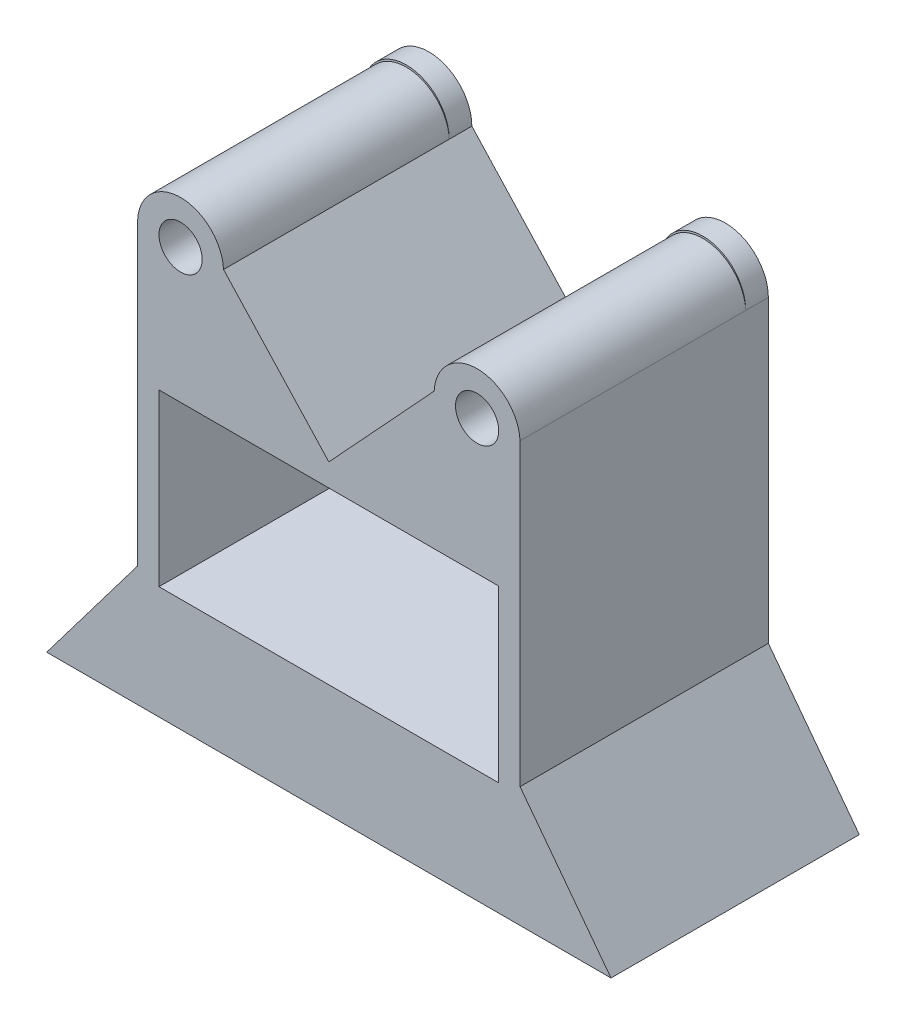
ISO-10303-21;
HEADER;
FILE_DESCRIPTION(('STEP AP214'),'2;1');
FILE_NAME('part.step','',(''),(''),'','','');
FILE_SCHEMA(('AUTOMOTIVE_DESIGN { 1 0 10303 214 1 1 1 1 }'));
ENDSEC;
DATA;
#1=APPLICATION_CONTEXT('core data for automotive mechanical design processes');
#2=APPLICATION_PROTOCOL_DEFINITION('international standard','automotive_design',2000,#1);
#3=PRODUCT_CONTEXT('',#1,'mechanical');
#4=PRODUCT('Part','Part','',(#3));
#5=PRODUCT_RELATED_PRODUCT_CATEGORY('part','',(#4));
#6=PRODUCT_DEFINITION_FORMATION('','',#4);
#7=PRODUCT_DEFINITION_CONTEXT('part definition',#1,'design');
#8=PRODUCT_DEFINITION('design','',#6,#7);
#9=PRODUCT_DEFINITION_SHAPE('','',#8);
#10=(LENGTH_UNIT() NAMED_UNIT(*) SI_UNIT(.MILLI.,.METRE.));
#11=(NAMED_UNIT(*) PLANE_ANGLE_UNIT() SI_UNIT($,.RADIAN.));
#12=(NAMED_UNIT(*) SI_UNIT($,.STERADIAN.) SOLID_ANGLE_UNIT());
#13=UNCERTAINTY_MEASURE_WITH_UNIT(LENGTH_MEASURE(1.E-05),#10,'distance_accuracy_value','');
#14=(GEOMETRIC_REPRESENTATION_CONTEXT(3) GLOBAL_UNCERTAINTY_ASSIGNED_CONTEXT((#13)) GLOBAL_UNIT_ASSIGNED_CONTEXT((#10,
#11,#12)) REPRESENTATION_CONTEXT('',''));
#15=CARTESIAN_POINT('',(0.,0.,0.));
#16=DIRECTION('',(0.,0.,1.));
#17=DIRECTION('',(1.,0.,0.));
#18=AXIS2_PLACEMENT_3D('',#15,#16,#17);
#19=CARTESIAN_POINT('',(33.364499946,49.439500054,50.8));
#20=DIRECTION('',(0.,0.,1.));
#21=DIRECTION('',(1.,0.,0.));
#22=AXIS2_PLACEMENT_3D('',#19,#20,#21);
#23=PLANE('',#22);
#24=CARTESIAN_POINT('',(-33.364499946,49.439500054,50.8));
#25=DIRECTION('',(0.,0.,1.));
#26=DIRECTION('',(1.,0.,0.));
#27=AXIS2_PLACEMENT_3D('',#24,#25,#26);
#28=CIRCLE('',#27,4.862500054);
#29=CARTESIAN_POINT('',(-28.501999892,49.439500054,50.8));
#30=VERTEX_POINT('',#29);
#31=EDGE_CURVE('E227',#30,#30,#28,.T.);
#32=ORIENTED_EDGE('',*,*,#31,.F.);
#33=EDGE_LOOP('',(#32));
#34=FACE_BOUND('',#33,.T.);
#35=DIRECTION('',(-0.603372043697109,-0.797459827756091,0.));
#36=VECTOR('',#35,1.);
#37=CARTESIAN_POINT('',(-43.029964919441,-17.5223314583823,50.8));
#38=LINE('',#37,#36);
#39=CARTESIAN_POINT('',(-43.029964919441,-17.5223314583823,50.8));
#40=VERTEX_POINT('',#39);
#41=CARTESIAN_POINT('',(-63.5,-44.577,50.8));
#42=VERTEX_POINT('',#41);
#43=EDGE_CURVE('E147',#40,#42,#38,.T.);
#44=ORIENTED_EDGE('',*,*,#43,.T.);
#45=DIRECTION('',(1.,0.,0.));
#46=VECTOR('',#45,1.);
#47=CARTESIAN_POINT('',(-63.5,-44.577,50.8));
#48=LINE('',#47,#46);
#49=CARTESIAN_POINT('',(63.5,-44.577,50.8));
#50=VERTEX_POINT('',#49);
#51=EDGE_CURVE('E260',#42,#50,#48,.T.);
#52=ORIENTED_EDGE('',*,*,#51,.T.);
#53=DIRECTION('',(-0.603372043697109,0.797459827756091,0.));
#54=VECTOR('',#53,1.);
#55=CARTESIAN_POINT('',(43.029964919441,-17.5223314583823,50.8));
#56=LINE('',#55,#54);
#57=CARTESIAN_POINT('',(43.029964919441,-17.5223314583823,50.8));
#58=VERTEX_POINT('',#57);
#59=EDGE_CURVE('E171',#50,#58,#56,.T.);
#60=ORIENTED_EDGE('',*,*,#59,.T.);
#61=DIRECTION('',(0.,1.,0.));
#62=VECTOR('',#61,1.);
#63=CARTESIAN_POINT('',(43.029964919441,-17.5223314583823,50.8));
#64=LINE('',#63,#62);
#65=CARTESIAN_POINT('',(43.029964919441,49.8910976898227,50.8));
#66=VERTEX_POINT('',#65);
#67=EDGE_CURVE('E263',#58,#66,#64,.T.);
#68=ORIENTED_EDGE('',*,*,#67,.T.);
#69=CARTESIAN_POINT('',(33.364499946,49.439500054,50.8));
#70=DIRECTION('',(0.,0.,1.));
#71=DIRECTION('',(1.,0.,0.));
#72=AXIS2_PLACEMENT_3D('',#69,#70,#71);
#73=CIRCLE('',#72,9.67600917617876);
#74=CARTESIAN_POINT('',(23.6995432779893,49.9018486053888,50.8));
#75=VERTEX_POINT('',#74);
#76=EDGE_CURVE('E265',#66,#75,#73,.T.);
#77=ORIENTED_EDGE('',*,*,#76,.T.);
#78=DIRECTION('',(-0.678703283861826,-0.734412590084875,0.));
#79=VECTOR('',#78,1.);
#80=CARTESIAN_POINT('',(23.6995432779893,49.9018486053888,50.8));
#81=LINE('',#80,#79);
#82=CARTESIAN_POINT('',(0.,24.257,50.8));
#83=VERTEX_POINT('',#82);
#84=EDGE_CURVE('E116',#75,#83,#81,.T.);
#85=ORIENTED_EDGE('',*,*,#84,.T.);
#86=DIRECTION('',(-0.678703283861826,0.734412590084875,0.));
#87=VECTOR('',#86,1.);
#88=CARTESIAN_POINT('',(-23.6995432779893,49.9018486053888,50.8));
#89=LINE('',#88,#87);
#90=CARTESIAN_POINT('',(-23.6995432779893,49.9018486053888,50.8));
#91=VERTEX_POINT('',#90);
#92=EDGE_CURVE('E109',#83,#91,#89,.T.);
#93=ORIENTED_EDGE('',*,*,#92,.T.);
#94=CARTESIAN_POINT('',(-33.364499946,49.439500054,50.8));
#95=DIRECTION('',(0.,0.,1.));
#96=DIRECTION('',(-1.,0.,0.));
#97=AXIS2_PLACEMENT_3D('',#94,#95,#96);
#98=CIRCLE('',#97,9.67600917617876);
#99=CARTESIAN_POINT('',(-43.029964919441,49.8910976898227,50.8));
#100=VERTEX_POINT('',#99);
#101=EDGE_CURVE('E113',#91,#100,#98,.T.);
#102=ORIENTED_EDGE('',*,*,#101,.T.);
#103=DIRECTION('',(0.,-1.,0.));
#104=VECTOR('',#103,1.);
#105=CARTESIAN_POINT('',(-43.029964919441,19.177,50.8));
#106=LINE('',#105,#104);
#107=EDGE_CURVE('E57',#100,#40,#106,.T.);
#108=ORIENTED_EDGE('',*,*,#107,.T.);
#109=EDGE_LOOP('',(#44,#52,#60,#68,#77,#85,#93,#102,#108));
#110=FACE_BOUND('',#109,.T.);
#111=DIRECTION('',(-1.,0.,0.));
#112=VECTOR('',#111,1.);
#113=CARTESIAN_POINT('',(-38.227,19.177,50.8));
#114=LINE('',#113,#112);
#115=CARTESIAN_POINT('',(38.227,19.177,50.8));
#116=VERTEX_POINT('',#115);
#117=CARTESIAN_POINT('',(-38.227,19.177,50.8));
#118=VERTEX_POINT('',#117);
#119=EDGE_CURVE('E236',#116,#118,#114,.T.);
#120=ORIENTED_EDGE('',*,*,#119,.F.);
#121=DIRECTION('',(0.,1.,0.));
#122=VECTOR('',#121,1.);
#123=CARTESIAN_POINT('',(38.227,-19.177,50.8));
#124=LINE('',#123,#122);
#125=CARTESIAN_POINT('',(38.227,-19.177,50.8));
#126=VERTEX_POINT('',#125);
#127=EDGE_CURVE('E233',#126,#116,#124,.T.);
#128=ORIENTED_EDGE('',*,*,#127,.F.);
#129=DIRECTION('',(1.,0.,0.));
#130=VECTOR('',#129,1.);
#131=CARTESIAN_POINT('',(-38.227,-19.177,50.8));
#132=LINE('',#131,#130);
#133=CARTESIAN_POINT('',(-38.227,-19.177,50.8));
#134=VERTEX_POINT('',#133);
#135=EDGE_CURVE('E78',#134,#126,#132,.T.);
#136=ORIENTED_EDGE('',*,*,#135,.F.);
#137=DIRECTION('',(0.,-1.,0.));
#138=VECTOR('',#137,1.);
#139=CARTESIAN_POINT('',(-38.227,-19.177,50.8));
#140=LINE('',#139,#138);
#141=EDGE_CURVE('E239',#118,#134,#140,.T.);
#142=ORIENTED_EDGE('',*,*,#141,.F.);
#143=EDGE_LOOP('',(#120,#128,#136,#142));
#144=FACE_BOUND('',#143,.T.);
#145=CARTESIAN_POINT('',(33.364499946,49.439500054,50.8));
#146=DIRECTION('',(0.,0.,1.));
#147=DIRECTION('',(-1.,0.,0.));
#148=AXIS2_PLACEMENT_3D('',#145,#146,#147);
#149=CIRCLE('',#148,4.862500054);
#150=CARTESIAN_POINT('',(28.501999892,49.439500054,50.8));
#151=VERTEX_POINT('',#150);
#152=EDGE_CURVE('E221',#151,#151,#149,.T.);
#153=ORIENTED_EDGE('',*,*,#152,.F.);
#154=EDGE_LOOP('',(#153));
#155=FACE_BOUND('',#154,.T.);
#156=ADVANCED_FACE('F33',(#34,#110,#144,#155),#23,.T.);
#157=CARTESIAN_POINT('',(-43.029964919441,-17.5223314583823,50.8));
#158=DIRECTION('',(0.797459827756091,-0.603372043697109,0.));
#159=DIRECTION('',(0.603372043697109,0.797459827756091,0.));
#160=AXIS2_PLACEMENT_3D('',#157,#158,#159);
#161=PLANE('',#160);
#162=DIRECTION('',(0.,0.,-1.));
#163=VECTOR('',#162,1.);
#164=CARTESIAN_POINT('',(-43.029964919441,-17.5223314583823,50.8));
#165=LINE('',#164,#163);
#166=CARTESIAN_POINT('',(-43.029964919441,-17.5223314583823,-5.08));
#167=VERTEX_POINT('',#166);
#168=EDGE_CURVE('E137',#40,#167,#165,.T.);
#169=ORIENTED_EDGE('',*,*,#168,.T.);
#170=DIRECTION('',(0.603372043697109,0.797459827756091,0.));
#171=VECTOR('',#170,1.);
#172=CARTESIAN_POINT('',(-63.5,-44.577,-5.08));
#173=LINE('',#172,#171);
#174=CARTESIAN_POINT('',(-63.5,-44.577,-5.08));
#175=VERTEX_POINT('',#174);
#176=EDGE_CURVE('E189',#175,#167,#173,.T.);
#177=ORIENTED_EDGE('',*,*,#176,.F.);
#178=DIRECTION('',(0.,0.,-1.));
#179=VECTOR('',#178,1.);
#180=CARTESIAN_POINT('',(-63.5,-44.577,50.8));
#181=LINE('',#180,#179);
#182=EDGE_CURVE('E11',#42,#175,#181,.T.);
#183=ORIENTED_EDGE('',*,*,#182,.F.);
#184=ORIENTED_EDGE('',*,*,#43,.F.);
#185=EDGE_LOOP('',(#169,#177,#183,#184));
#186=FACE_BOUND('',#185,.T.);
#187=ADVANCED_FACE('F35',(#186),#161,.F.);
#188=CARTESIAN_POINT('',(-63.5,-44.577,50.8));
#189=DIRECTION('',(0.,1.,0.));
#190=DIRECTION('',(0.,0.,1.));
#191=AXIS2_PLACEMENT_3D('',#188,#189,#190);
#192=PLANE('',#191);
#193=ORIENTED_EDGE('',*,*,#182,.T.);
#194=DIRECTION('',(-1.,0.,0.));
#195=VECTOR('',#194,1.);
#196=CARTESIAN_POINT('',(63.5,-44.577,-5.08));
#197=LINE('',#196,#195);
#198=CARTESIAN_POINT('',(63.5,-44.577,-5.08));
#199=VERTEX_POINT('',#198);
#200=EDGE_CURVE('E182',#199,#175,#197,.T.);
#201=ORIENTED_EDGE('',*,*,#200,.F.);
#202=DIRECTION('',(0.,0.,-1.));
#203=VECTOR('',#202,1.);
#204=CARTESIAN_POINT('',(63.5,-44.577,50.8));
#205=LINE('',#204,#203);
#206=EDGE_CURVE('E41',#50,#199,#205,.T.);
#207=ORIENTED_EDGE('',*,*,#206,.F.);
#208=ORIENTED_EDGE('',*,*,#51,.F.);
#209=EDGE_LOOP('',(#193,#201,#207,#208));
#210=FACE_BOUND('',#209,.T.);
#211=ADVANCED_FACE('F187',(#210),#192,.F.);
#212=CARTESIAN_POINT('',(43.029964919441,-17.5223314583823,50.8));
#213=DIRECTION('',(-0.797459827756091,-0.603372043697109,0.));
#214=DIRECTION('',(0.603372043697109,-0.797459827756091,0.));
#215=AXIS2_PLACEMENT_3D('',#212,#213,#214);
#216=PLANE('',#215);
#217=ORIENTED_EDGE('',*,*,#206,.T.);
#218=DIRECTION('',(0.603372043697109,-0.797459827756091,0.));
#219=VECTOR('',#218,1.);
#220=CARTESIAN_POINT('',(43.029964919441,-17.5223314583823,-5.08));
#221=LINE('',#220,#219);
#222=CARTESIAN_POINT('',(43.029964919441,-17.5223314583823,-5.08));
#223=VERTEX_POINT('',#222);
#224=EDGE_CURVE('E170',#223,#199,#221,.T.);
#225=ORIENTED_EDGE('',*,*,#224,.F.);
#226=DIRECTION('',(0.,0.,-1.));
#227=VECTOR('',#226,1.);
#228=CARTESIAN_POINT('',(43.029964919441,-17.5223314583823,50.8));
#229=LINE('',#228,#227);
#230=EDGE_CURVE('E158',#58,#223,#229,.T.);
#231=ORIENTED_EDGE('',*,*,#230,.F.);
#232=ORIENTED_EDGE('',*,*,#59,.F.);
#233=EDGE_LOOP('',(#217,#225,#231,#232));
#234=FACE_BOUND('',#233,.T.);
#235=ADVANCED_FACE('F167',(#234),#216,.F.);
#236=CARTESIAN_POINT('',(43.029964919441,19.177,50.8));
#237=DIRECTION('',(-1.,0.,0.));
#238=DIRECTION('',(0.,0.,1.));
#239=AXIS2_PLACEMENT_3D('',#236,#237,#238);
#240=PLANE('',#239);
#241=ORIENTED_EDGE('',*,*,#230,.T.);
#242=DIRECTION('',(0.,-1.,0.));
#243=VECTOR('',#242,1.);
#244=CARTESIAN_POINT('',(43.029964919441,49.8910976898227,-5.08));
#245=LINE('',#244,#243);
#246=CARTESIAN_POINT('',(43.029964919441,49.8910976898227,-5.08));
#247=VERTEX_POINT('',#246);
#248=EDGE_CURVE('E185',#247,#223,#245,.T.);
#249=ORIENTED_EDGE('',*,*,#248,.F.);
#250=DIRECTION('',(0.,0.,1.));
#251=VECTOR('',#250,1.);
#252=CARTESIAN_POINT('',(43.029964919441,49.8910976898227,-5.08));
#253=LINE('',#252,#251);
#254=CARTESIAN_POINT('',(43.029964919441,49.8910976898227,0.));
#255=VERTEX_POINT('',#254);
#256=EDGE_CURVE('E217',#247,#255,#253,.T.);
#257=ORIENTED_EDGE('',*,*,#256,.T.);
#258=DIRECTION('',(0.,0.,-1.));
#259=VECTOR('',#258,1.);
#260=CARTESIAN_POINT('',(43.029964919441,49.8910976898227,50.8));
#261=LINE('',#260,#259);
#262=EDGE_CURVE('E155',#66,#255,#261,.T.);
#263=ORIENTED_EDGE('',*,*,#262,.F.);
#264=ORIENTED_EDGE('',*,*,#67,.F.);
#265=EDGE_LOOP('',(#241,#249,#257,#263,#264));
#266=FACE_BOUND('',#265,.T.);
#267=ADVANCED_FACE('F302',(#266),#240,.F.);
#268=CARTESIAN_POINT('',(33.364499946,49.439500054,50.8));
#269=DIRECTION('',(0.,0.,-1.));
#270=DIRECTION('',(-1.,0.,0.));
#271=AXIS2_PLACEMENT_3D('',#268,#269,#270);
#272=CYLINDRICAL_SURFACE('',#271,9.67600917617876);
#273=CARTESIAN_POINT('',(33.364499946,49.439500054,0.));
#274=DIRECTION('',(0.,0.,1.));
#275=DIRECTION('',(1.,0.,0.));
#276=AXIS2_PLACEMENT_3D('',#273,#274,#275);
#277=CIRCLE('',#276,9.67600917617876);
#278=CARTESIAN_POINT('',(23.6995432779893,49.9018486053888,0.));
#279=VERTEX_POINT('',#278);
#280=EDGE_CURVE('E141',#255,#279,#277,.T.);
#281=ORIENTED_EDGE('',*,*,#280,.T.);
#282=DIRECTION('',(0.,0.,-1.));
#283=VECTOR('',#282,1.);
#284=CARTESIAN_POINT('',(23.6995432779893,49.9018486053888,50.8));
#285=LINE('',#284,#283);
#286=EDGE_CURVE('E152',#75,#279,#285,.T.);
#287=ORIENTED_EDGE('',*,*,#286,.F.);
#288=ORIENTED_EDGE('',*,*,#76,.F.);
#289=ORIENTED_EDGE('',*,*,#262,.T.);
#290=EDGE_LOOP('',(#281,#287,#288,#289));
#291=FACE_BOUND('',#290,.T.);
#292=ADVANCED_FACE('F271',(#291),#272,.T.);
#293=CARTESIAN_POINT('',(23.6995432779893,49.9018486053888,50.8));
#294=DIRECTION('',(0.734412590084875,-0.678703283861825,0.));
#295=DIRECTION('',(0.678703283861826,0.734412590084875,0.));
#296=AXIS2_PLACEMENT_3D('',#293,#294,#295);
#297=PLANE('',#296);
#298=ORIENTED_EDGE('',*,*,#286,.T.);
#299=DIRECTION('',(0.,0.,1.));
#300=VECTOR('',#299,1.);
#301=CARTESIAN_POINT('',(23.6995432779893,49.9018486053888,-5.08));
#302=LINE('',#301,#300);
#303=CARTESIAN_POINT('',(23.6995432779893,49.9018486053888,-5.08));
#304=VERTEX_POINT('',#303);
#305=EDGE_CURVE('E206',#304,#279,#302,.T.);
#306=ORIENTED_EDGE('',*,*,#305,.F.);
#307=DIRECTION('',(0.678703283861826,0.734412590084875,0.));
#308=VECTOR('',#307,1.);
#309=CARTESIAN_POINT('',(0.,24.257,-5.08));
#310=LINE('',#309,#308);
#311=CARTESIAN_POINT('',(0.,24.257,-5.08));
#312=VERTEX_POINT('',#311);
#313=EDGE_CURVE('E203',#312,#304,#310,.T.);
#314=ORIENTED_EDGE('',*,*,#313,.F.);
#315=DIRECTION('',(0.,0.,-1.));
#316=VECTOR('',#315,1.);
#317=CARTESIAN_POINT('',(0.,24.257,50.8));
#318=LINE('',#317,#316);
#319=EDGE_CURVE('E131',#83,#312,#318,.T.);
#320=ORIENTED_EDGE('',*,*,#319,.F.);
#321=ORIENTED_EDGE('',*,*,#84,.F.);
#322=EDGE_LOOP('',(#298,#306,#314,#320,#321));
#323=FACE_BOUND('',#322,.T.);
#324=ADVANCED_FACE('F274',(#323),#297,.F.);
#325=CARTESIAN_POINT('',(-23.6995432779893,49.9018486053888,50.8));
#326=DIRECTION('',(-0.734412590084874,-0.678703283861826,0.));
#327=DIRECTION('',(0.678703283861826,-0.734412590084874,0.));
#328=AXIS2_PLACEMENT_3D('',#325,#326,#327);
#329=PLANE('',#328);
#330=ORIENTED_EDGE('',*,*,#319,.T.);
#331=DIRECTION('',(0.678703283861826,-0.734412590084875,0.));
#332=VECTOR('',#331,1.);
#333=CARTESIAN_POINT('',(-23.6995432779893,49.9018486053888,-5.08));
#334=LINE('',#333,#332);
#335=CARTESIAN_POINT('',(-23.6995432779893,49.9018486053888,-5.08));
#336=VERTEX_POINT('',#335);
#337=EDGE_CURVE('E200',#336,#312,#334,.T.);
#338=ORIENTED_EDGE('',*,*,#337,.F.);
#339=DIRECTION('',(0.,0.,1.));
#340=VECTOR('',#339,1.);
#341=CARTESIAN_POINT('',(-23.6995432779893,49.9018486053888,-5.08));
#342=LINE('',#341,#340);
#343=CARTESIAN_POINT('',(-23.6995432779893,49.9018486053888,0.));
#344=VERTEX_POINT('',#343);
#345=EDGE_CURVE('E128',#336,#344,#342,.T.);
#346=ORIENTED_EDGE('',*,*,#345,.T.);
#347=DIRECTION('',(0.,0.,-1.));
#348=VECTOR('',#347,1.);
#349=CARTESIAN_POINT('',(-23.6995432779893,49.9018486053888,50.8));
#350=LINE('',#349,#348);
#351=EDGE_CURVE('E123',#91,#344,#350,.T.);
#352=ORIENTED_EDGE('',*,*,#351,.F.);
#353=ORIENTED_EDGE('',*,*,#92,.F.);
#354=EDGE_LOOP('',(#330,#338,#346,#352,#353));
#355=FACE_BOUND('',#354,.T.);
#356=ADVANCED_FACE('F124',(#355),#329,.F.);
#357=CARTESIAN_POINT('',(-33.364499946,49.439500054,50.8));
#358=DIRECTION('',(0.,0.,-1.));
#359=DIRECTION('',(-1.,0.,0.));
#360=AXIS2_PLACEMENT_3D('',#357,#358,#359);
#361=CYLINDRICAL_SURFACE('',#360,9.67600917617876);
#362=CARTESIAN_POINT('',(-33.364499946,49.439500054,0.));
#363=DIRECTION('',(0.,0.,1.));
#364=DIRECTION('',(-1.,0.,0.));
#365=AXIS2_PLACEMENT_3D('',#362,#363,#364);
#366=CIRCLE('',#365,9.67600917617876);
#367=CARTESIAN_POINT('',(-43.029964919441,49.8910976898227,0.));
#368=VERTEX_POINT('',#367);
#369=EDGE_CURVE('E144',#344,#368,#366,.T.);
#370=ORIENTED_EDGE('',*,*,#369,.T.);
#371=DIRECTION('',(0.,0.,-1.));
#372=VECTOR('',#371,1.);
#373=CARTESIAN_POINT('',(-43.029964919441,49.8910976898227,50.8));
#374=LINE('',#373,#372);
#375=EDGE_CURVE('E132',#100,#368,#374,.T.);
#376=ORIENTED_EDGE('',*,*,#375,.F.);
#377=ORIENTED_EDGE('',*,*,#101,.F.);
#378=ORIENTED_EDGE('',*,*,#351,.T.);
#379=EDGE_LOOP('',(#370,#376,#377,#378));
#380=FACE_BOUND('',#379,.T.);
#381=ADVANCED_FACE('F134',(#380),#361,.T.);
#382=CARTESIAN_POINT('',(-43.029964919441,-17.5223314583823,50.8));
#383=DIRECTION('',(1.,0.,0.));
#384=DIRECTION('',(0.,0.,-1.));
#385=AXIS2_PLACEMENT_3D('',#382,#383,#384);
#386=PLANE('',#385);
#387=ORIENTED_EDGE('',*,*,#375,.T.);
#388=DIRECTION('',(0.,0.,1.));
#389=VECTOR('',#388,1.);
#390=CARTESIAN_POINT('',(-43.029964919441,49.8910976898227,-5.08));
#391=LINE('',#390,#389);
#392=CARTESIAN_POINT('',(-43.029964919441,49.8910976898227,-5.08));
#393=VERTEX_POINT('',#392);
#394=EDGE_CURVE('E214',#393,#368,#391,.T.);
#395=ORIENTED_EDGE('',*,*,#394,.F.);
#396=DIRECTION('',(0.,1.,0.));
#397=VECTOR('',#396,1.);
#398=CARTESIAN_POINT('',(-43.029964919441,-17.5223314583823,-5.08));
#399=LINE('',#398,#397);
#400=EDGE_CURVE('E191',#167,#393,#399,.T.);
#401=ORIENTED_EDGE('',*,*,#400,.F.);
#402=ORIENTED_EDGE('',*,*,#168,.F.);
#403=ORIENTED_EDGE('',*,*,#107,.F.);
#404=EDGE_LOOP('',(#387,#395,#401,#402,#403));
#405=FACE_BOUND('',#404,.T.);
#406=ADVANCED_FACE('F297',(#405),#386,.F.);
#407=CARTESIAN_POINT('',(38.227,-19.177,50.8));
#408=DIRECTION('',(-1.,0.,0.));
#409=DIRECTION('',(0.,0.,1.));
#410=AXIS2_PLACEMENT_3D('',#407,#408,#409);
#411=PLANE('',#410);
#412=DIRECTION('',(0.,1.,0.));
#413=VECTOR('',#412,1.);
#414=CARTESIAN_POINT('',(38.227,-19.177,0.));
#415=LINE('',#414,#413);
#416=CARTESIAN_POINT('',(38.227,-19.177,0.));
#417=VERTEX_POINT('',#416);
#418=CARTESIAN_POINT('',(38.227,19.177,0.));
#419=VERTEX_POINT('',#418);
#420=EDGE_CURVE('E230',#417,#419,#415,.T.);
#421=ORIENTED_EDGE('',*,*,#420,.F.);
#422=DIRECTION('',(0.,0.,-1.));
#423=VECTOR('',#422,1.);
#424=CARTESIAN_POINT('',(38.227,-19.177,50.8));
#425=LINE('',#424,#423);
#426=EDGE_CURVE('E242',#126,#417,#425,.T.);
#427=ORIENTED_EDGE('',*,*,#426,.F.);
#428=ORIENTED_EDGE('',*,*,#127,.T.);
#429=DIRECTION('',(0.,0.,-1.));
#430=VECTOR('',#429,1.);
#431=CARTESIAN_POINT('',(38.227,19.177,50.8));
#432=LINE('',#431,#430);
#433=EDGE_CURVE('E145',#116,#419,#432,.T.);
#434=ORIENTED_EDGE('',*,*,#433,.T.);
#435=EDGE_LOOP('',(#421,#427,#428,#434));
#436=FACE_BOUND('',#435,.T.);
#437=ADVANCED_FACE('F311',(#436),#411,.T.);
#438=CARTESIAN_POINT('',(-38.227,19.177,50.8));
#439=DIRECTION('',(0.,-1.,0.));
#440=DIRECTION('',(0.,0.,-1.));
#441=AXIS2_PLACEMENT_3D('',#438,#439,#440);
#442=PLANE('',#441);
#443=DIRECTION('',(-1.,0.,0.));
#444=VECTOR('',#443,1.);
#445=CARTESIAN_POINT('',(-38.227,19.177,0.));
#446=LINE('',#445,#444);
#447=CARTESIAN_POINT('',(-38.227,19.177,0.));
#448=VERTEX_POINT('',#447);
#449=EDGE_CURVE('E245',#419,#448,#446,.T.);
#450=ORIENTED_EDGE('',*,*,#449,.F.);
#451=ORIENTED_EDGE('',*,*,#433,.F.);
#452=ORIENTED_EDGE('',*,*,#119,.T.);
#453=DIRECTION('',(0.,0.,-1.));
#454=VECTOR('',#453,1.);
#455=CARTESIAN_POINT('',(-38.227,19.177,50.8));
#456=LINE('',#455,#454);
#457=EDGE_CURVE('E255',#118,#448,#456,.T.);
#458=ORIENTED_EDGE('',*,*,#457,.T.);
#459=EDGE_LOOP('',(#450,#451,#452,#458));
#460=FACE_BOUND('',#459,.T.);
#461=ADVANCED_FACE('F314',(#460),#442,.T.);
#462=CARTESIAN_POINT('',(-38.227,-19.177,50.8));
#463=DIRECTION('',(1.,0.,0.));
#464=DIRECTION('',(0.,0.,-1.));
#465=AXIS2_PLACEMENT_3D('',#462,#463,#464);
#466=PLANE('',#465);
#467=DIRECTION('',(0.,-1.,0.));
#468=VECTOR('',#467,1.);
#469=CARTESIAN_POINT('',(-38.227,-19.177,0.));
#470=LINE('',#469,#468);
#471=CARTESIAN_POINT('',(-38.227,-19.177,0.));
#472=VERTEX_POINT('',#471);
#473=EDGE_CURVE('E248',#448,#472,#470,.T.);
#474=ORIENTED_EDGE('',*,*,#473,.F.);
#475=ORIENTED_EDGE('',*,*,#457,.F.);
#476=ORIENTED_EDGE('',*,*,#141,.T.);
#477=DIRECTION('',(0.,0.,-1.));
#478=VECTOR('',#477,1.);
#479=CARTESIAN_POINT('',(-38.227,-19.177,50.8));
#480=LINE('',#479,#478);
#481=EDGE_CURVE('E48',#134,#472,#480,.T.);
#482=ORIENTED_EDGE('',*,*,#481,.T.);
#483=EDGE_LOOP('',(#474,#475,#476,#482));
#484=FACE_BOUND('',#483,.T.);
#485=ADVANCED_FACE('F320',(#484),#466,.T.);
#486=CARTESIAN_POINT('',(-38.227,-19.177,50.8));
#487=DIRECTION('',(0.,1.,0.));
#488=DIRECTION('',(0.,0.,1.));
#489=AXIS2_PLACEMENT_3D('',#486,#487,#488);
#490=PLANE('',#489);
#491=DIRECTION('',(1.,0.,0.));
#492=VECTOR('',#491,1.);
#493=CARTESIAN_POINT('',(-38.227,-19.177,0.));
#494=LINE('',#493,#492);
#495=EDGE_CURVE('E237',#472,#417,#494,.T.);
#496=ORIENTED_EDGE('',*,*,#495,.F.);
#497=ORIENTED_EDGE('',*,*,#481,.F.);
#498=ORIENTED_EDGE('',*,*,#135,.T.);
#499=ORIENTED_EDGE('',*,*,#426,.T.);
#500=EDGE_LOOP('',(#496,#497,#498,#499));
#501=FACE_BOUND('',#500,.T.);
#502=ADVANCED_FACE('F323',(#501),#490,.T.);
#503=CARTESIAN_POINT('',(-33.364499946,49.439500054,50.8));
#504=DIRECTION('',(0.,0.,-1.));
#505=DIRECTION('',(-1.,0.,0.));
#506=AXIS2_PLACEMENT_3D('',#503,#504,#505);
#507=CYLINDRICAL_SURFACE('',#506,4.862500054);
#508=ORIENTED_EDGE('',*,*,#31,.T.);
#509=EDGE_LOOP('',(#508));
#510=FACE_BOUND('',#509,.T.);
#511=CARTESIAN_POINT('',(-33.364499946,49.439500054,0.));
#512=DIRECTION('',(0.,0.,1.));
#513=DIRECTION('',(1.,0.,0.));
#514=AXIS2_PLACEMENT_3D('',#511,#512,#513);
#515=CIRCLE('',#514,4.862500054);
#516=CARTESIAN_POINT('',(-28.501999892,49.439500054,0.));
#517=VERTEX_POINT('',#516);
#518=EDGE_CURVE('E224',#517,#517,#515,.T.);
#519=ORIENTED_EDGE('',*,*,#518,.F.);
#520=EDGE_LOOP('',(#519));
#521=FACE_BOUND('',#520,.T.);
#522=ADVANCED_FACE('F325',(#510,#521),#507,.F.);
#523=CARTESIAN_POINT('',(33.364499946,49.439500054,50.8));
#524=DIRECTION('',(0.,0.,-1.));
#525=DIRECTION('',(-1.,0.,0.));
#526=AXIS2_PLACEMENT_3D('',#523,#524,#525);
#527=CYLINDRICAL_SURFACE('',#526,4.862500054);
#528=ORIENTED_EDGE('',*,*,#152,.T.);
#529=EDGE_LOOP('',(#528));
#530=FACE_BOUND('',#529,.T.);
#531=CARTESIAN_POINT('',(33.364499946,49.439500054,0.));
#532=DIRECTION('',(0.,0.,1.));
#533=DIRECTION('',(-1.,0.,0.));
#534=AXIS2_PLACEMENT_3D('',#531,#532,#533);
#535=CIRCLE('',#534,4.862500054);
#536=CARTESIAN_POINT('',(28.501999892,49.439500054,0.));
#537=VERTEX_POINT('',#536);
#538=EDGE_CURVE('E220',#537,#537,#535,.T.);
#539=ORIENTED_EDGE('',*,*,#538,.F.);
#540=EDGE_LOOP('',(#539));
#541=FACE_BOUND('',#540,.T.);
#542=ADVANCED_FACE('F331',(#530,#541),#527,.F.);
#543=CARTESIAN_POINT('',(33.3647511090705,49.8910976898227,0.));
#544=DIRECTION('',(0.,0.,1.));
#545=DIRECTION('',(1.,0.,0.));
#546=AXIS2_PLACEMENT_3D('',#543,#544,#545);
#547=PLANE('',#546);
#548=ORIENTED_EDGE('',*,*,#538,.T.);
#549=EDGE_LOOP('',(#548));
#550=FACE_BOUND('',#549,.T.);
#551=ADVANCED_FACE('F415',(#550),#547,.T.);
#552=ORIENTED_EDGE('',*,*,#495,.T.);
#553=ORIENTED_EDGE('',*,*,#420,.T.);
#554=ORIENTED_EDGE('',*,*,#449,.T.);
#555=ORIENTED_EDGE('',*,*,#473,.T.);
#556=EDGE_LOOP('',(#552,#553,#554,#555));
#557=FACE_BOUND('',#556,.T.);
#558=ADVANCED_FACE('F322',(#557),#547,.T.);
#559=CARTESIAN_POINT('',(33.3647511090705,49.8910976898227,-5.08));
#560=DIRECTION('',(0.,0.,1.));
#561=DIRECTION('',(1.,0.,0.));
#562=AXIS2_PLACEMENT_3D('',#559,#560,#561);
#563=PLANE('',#562);
#564=CARTESIAN_POINT('',(33.3647511090705,49.8910976898227,-5.08));
#565=DIRECTION('',(0.,0.,-1.));
#566=DIRECTION('',(1.,0.,0.));
#567=AXIS2_PLACEMENT_3D('',#564,#565,#566);
#568=CIRCLE('',#567,9.66521381037055);
#569=EDGE_CURVE('E211',#304,#247,#568,.T.);
#570=ORIENTED_EDGE('',*,*,#569,.T.);
#571=ORIENTED_EDGE('',*,*,#248,.T.);
#572=ORIENTED_EDGE('',*,*,#224,.T.);
#573=ORIENTED_EDGE('',*,*,#200,.T.);
#574=ORIENTED_EDGE('',*,*,#176,.T.);
#575=ORIENTED_EDGE('',*,*,#400,.T.);
#576=CARTESIAN_POINT('',(-33.3647511090704,49.8910976898227,-5.08));
#577=DIRECTION('',(0.,0.,-1.));
#578=DIRECTION('',(1.,0.,0.));
#579=AXIS2_PLACEMENT_3D('',#576,#577,#578);
#580=CIRCLE('',#579,9.66521381037056);
#581=EDGE_CURVE('E197',#393,#336,#580,.T.);
#582=ORIENTED_EDGE('',*,*,#581,.T.);
#583=ORIENTED_EDGE('',*,*,#337,.T.);
#584=ORIENTED_EDGE('',*,*,#313,.T.);
#585=EDGE_LOOP('',(#570,#571,#572,#573,#574,#575,#582,#583,#584));
#586=FACE_BOUND('',#585,.T.);
#587=ADVANCED_FACE('F180',(#586),#563,.F.);
#588=CARTESIAN_POINT('',(-33.3647511090704,49.8910976898227,-5.08));
#589=DIRECTION('',(0.,0.,1.));
#590=DIRECTION('',(1.,0.,0.));
#591=AXIS2_PLACEMENT_3D('',#588,#589,#590);
#592=CYLINDRICAL_SURFACE('',#591,9.66521381037056);
#593=CARTESIAN_POINT('',(-33.3647511090704,49.8910976898227,0.));
#594=DIRECTION('',(0.,0.,-1.));
#595=DIRECTION('',(1.,0.,0.));
#596=AXIS2_PLACEMENT_3D('',#593,#594,#595);
#597=CIRCLE('',#596,9.66521381037056);
#598=EDGE_CURVE('E208',#368,#344,#597,.T.);
#599=ORIENTED_EDGE('',*,*,#598,.T.);
#600=ORIENTED_EDGE('',*,*,#345,.F.);
#601=ORIENTED_EDGE('',*,*,#581,.F.);
#602=ORIENTED_EDGE('',*,*,#394,.T.);
#603=EDGE_LOOP('',(#599,#600,#601,#602));
#604=FACE_BOUND('',#603,.T.);
#605=ADVANCED_FACE('F286',(#604),#592,.T.);
#606=CARTESIAN_POINT('',(33.3647511090705,49.8910976898227,-5.08));
#607=DIRECTION('',(0.,0.,1.));
#608=DIRECTION('',(1.,0.,0.));
#609=AXIS2_PLACEMENT_3D('',#606,#607,#608);
#610=CYLINDRICAL_SURFACE('',#609,9.66521381037055);
#611=CARTESIAN_POINT('',(33.3647511090705,49.8910976898227,0.));
#612=DIRECTION('',(0.,0.,-1.));
#613=DIRECTION('',(1.,0.,0.));
#614=AXIS2_PLACEMENT_3D('',#611,#612,#613);
#615=CIRCLE('',#614,9.66521381037055);
#616=EDGE_CURVE('E69',#279,#255,#615,.T.);
#617=ORIENTED_EDGE('',*,*,#616,.T.);
#618=ORIENTED_EDGE('',*,*,#256,.F.);
#619=ORIENTED_EDGE('',*,*,#569,.F.);
#620=ORIENTED_EDGE('',*,*,#305,.T.);
#621=EDGE_LOOP('',(#617,#618,#619,#620));
#622=FACE_BOUND('',#621,.T.);
#623=ADVANCED_FACE('F446',(#622),#610,.T.);
#624=ORIENTED_EDGE('',*,*,#280,.F.);
#625=ORIENTED_EDGE('',*,*,#616,.F.);
#626=EDGE_LOOP('',(#624,#625));
#627=FACE_BOUND('',#626,.T.);
#628=ADVANCED_FACE('F455',(#627),#547,.T.);
#629=ORIENTED_EDGE('',*,*,#369,.F.);
#630=ORIENTED_EDGE('',*,*,#598,.F.);
#631=EDGE_LOOP('',(#629,#630));
#632=FACE_BOUND('',#631,.T.);
#633=ADVANCED_FACE('F293',(#632),#547,.T.);
#634=ORIENTED_EDGE('',*,*,#518,.T.);
#635=EDGE_LOOP('',(#634));
#636=FACE_BOUND('',#635,.T.);
#637=ADVANCED_FACE('F430',(#636),#547,.T.);
#638=CLOSED_SHELL('',(#156,#187,#211,#235,#267,#292,#324,#356,#381,#406,#437,#461,#485,#502,
#522,#542,#551,#558,#587,#605,#623,#628,#633,#637));
#639=MANIFOLD_SOLID_BREP('B2',#638);
#640=ADVANCED_BREP_SHAPE_REPRESENTATION('',(#18,#639),#14);
#641=SHAPE_DEFINITION_REPRESENTATION(#9,#640);
ENDSEC;
END-ISO-10303-21;
